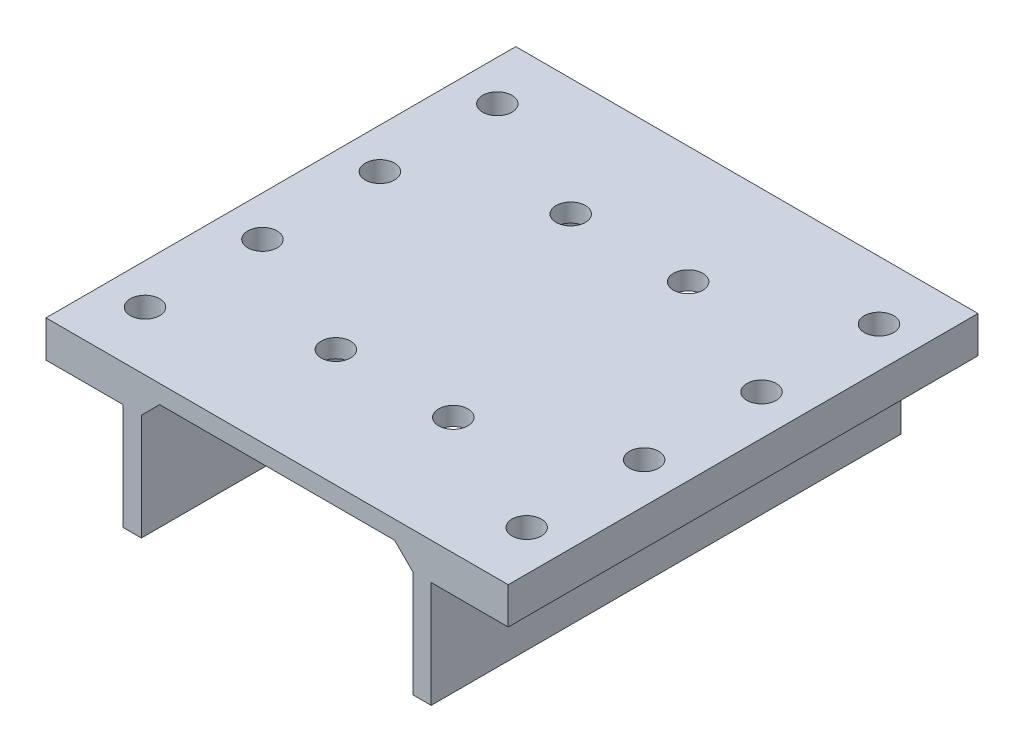
ISO-10303-21;
HEADER;
FILE_DESCRIPTION(('STEP AP214'),'2;1');
FILE_NAME('part.step','',(''),(''),'','','');
FILE_SCHEMA(('AUTOMOTIVE_DESIGN { 1 0 10303 214 1 1 1 1 }'));
ENDSEC;
DATA;
#1=APPLICATION_CONTEXT('core data for automotive mechanical design processes');
#2=APPLICATION_PROTOCOL_DEFINITION('international standard','automotive_design',2000,#1);
#3=PRODUCT_CONTEXT('',#1,'mechanical');
#4=PRODUCT('Part','Part','',(#3));
#5=PRODUCT_RELATED_PRODUCT_CATEGORY('part','',(#4));
#6=PRODUCT_DEFINITION_FORMATION('','',#4);
#7=PRODUCT_DEFINITION_CONTEXT('part definition',#1,'design');
#8=PRODUCT_DEFINITION('design','',#6,#7);
#9=PRODUCT_DEFINITION_SHAPE('','',#8);
#10=(LENGTH_UNIT() NAMED_UNIT(*) SI_UNIT(.MILLI.,.METRE.));
#11=(NAMED_UNIT(*) PLANE_ANGLE_UNIT() SI_UNIT($,.RADIAN.));
#12=(NAMED_UNIT(*) SI_UNIT($,.STERADIAN.) SOLID_ANGLE_UNIT());
#13=UNCERTAINTY_MEASURE_WITH_UNIT(LENGTH_MEASURE(1.E-05),#10,'distance_accuracy_value','');
#14=(GEOMETRIC_REPRESENTATION_CONTEXT(3) GLOBAL_UNCERTAINTY_ASSIGNED_CONTEXT((#13)) GLOBAL_UNIT_ASSIGNED_CONTEXT((#10,
#11,#12)) REPRESENTATION_CONTEXT('',''));
#15=CARTESIAN_POINT('',(0.,0.,0.));
#16=DIRECTION('',(0.,0.,1.));
#17=DIRECTION('',(1.,0.,0.));
#18=AXIS2_PLACEMENT_3D('',#15,#16,#17);
#19=CARTESIAN_POINT('',(89.211261032544,90.34609206336,101.6));
#20=DIRECTION('',(0.,1.,0.));
#21=DIRECTION('',(0.,0.,1.));
#22=AXIS2_PLACEMENT_3D('',#19,#20,#21);
#23=PLANE('',#22);
#24=DIRECTION('',(1.,0.,0.));
#25=VECTOR('',#24,1.);
#26=CARTESIAN_POINT('',(89.211261032544,90.34609206336,0.));
#27=LINE('',#26,#25);
#28=CARTESIAN_POINT('',(89.211261032544,90.34609206336,0.));
#29=VERTEX_POINT('',#28);
#30=CARTESIAN_POINT('',(93.173661032544,90.34609206336,0.));
#31=VERTEX_POINT('',#30);
#32=EDGE_CURVE('E167',#29,#31,#27,.T.);
#33=ORIENTED_EDGE('',*,*,#32,.T.);
#34=DIRECTION('',(0.,0.,-1.));
#35=VECTOR('',#34,1.);
#36=CARTESIAN_POINT('',(93.173661032544,90.34609206336,101.6));
#37=LINE('',#36,#35);
#38=CARTESIAN_POINT('',(93.173661032544,90.34609206336,101.6));
#39=VERTEX_POINT('',#38);
#40=EDGE_CURVE('E11',#39,#31,#37,.T.);
#41=ORIENTED_EDGE('',*,*,#40,.F.);
#42=DIRECTION('',(1.,0.,0.));
#43=VECTOR('',#42,1.);
#44=CARTESIAN_POINT('',(89.211261032544,90.34609206336,101.6));
#45=LINE('',#44,#43);
#46=CARTESIAN_POINT('',(89.211261032544,90.34609206336,101.6));
#47=VERTEX_POINT('',#46);
#48=EDGE_CURVE('E194',#47,#39,#45,.T.);
#49=ORIENTED_EDGE('',*,*,#48,.F.);
#50=DIRECTION('',(0.,0.,-1.));
#51=VECTOR('',#50,1.);
#52=CARTESIAN_POINT('',(89.211261032544,90.34609206336,101.6));
#53=LINE('',#52,#51);
#54=EDGE_CURVE('E163',#47,#29,#53,.T.);
#55=ORIENTED_EDGE('',*,*,#54,.T.);
#56=EDGE_LOOP('',(#33,#41,#49,#55));
#57=FACE_BOUND('',#56,.T.);
#58=ADVANCED_FACE('F33',(#57),#23,.F.);
#59=CARTESIAN_POINT('',(93.173661032544,90.34609206336,101.6));
#60=DIRECTION('',(-1.,0.,0.));
#61=DIRECTION('',(0.,0.,1.));
#62=AXIS2_PLACEMENT_3D('',#59,#60,#61);
#63=PLANE('',#62);
#64=CARTESIAN_POINT('',(93.173661032544,99.87109206336,76.2));
#65=DIRECTION('',(-1.,0.,0.));
#66=DIRECTION('',(0.,0.,1.));
#67=AXIS2_PLACEMENT_3D('',#64,#65,#66);
#68=CIRCLE('',#67,3.17500000000001);
#69=CARTESIAN_POINT('',(93.173661032544,99.87109206336,79.375));
#70=VERTEX_POINT('',#69);
#71=EDGE_CURVE('E578',#70,#70,#68,.T.);
#72=ORIENTED_EDGE('',*,*,#71,.T.);
#73=EDGE_LOOP('',(#72));
#74=FACE_BOUND('',#73,.T.);
#75=CARTESIAN_POINT('',(93.173661032544,99.87109206336,25.4));
#76=DIRECTION('',(-1.,0.,0.));
#77=DIRECTION('',(0.,0.,1.));
#78=AXIS2_PLACEMENT_3D('',#75,#76,#77);
#79=CIRCLE('',#78,3.175);
#80=CARTESIAN_POINT('',(93.173661032544,99.87109206336,28.575));
#81=VERTEX_POINT('',#80);
#82=EDGE_CURVE('E594',#81,#81,#79,.T.);
#83=ORIENTED_EDGE('',*,*,#82,.T.);
#84=EDGE_LOOP('',(#83));
#85=FACE_BOUND('',#84,.T.);
#86=DIRECTION('',(0.,1.,0.));
#87=VECTOR('',#86,1.);
#88=CARTESIAN_POINT('',(93.173661032544,90.34609206336,0.));
#89=LINE('',#88,#87);
#90=CARTESIAN_POINT('',(93.173661032544,113.35849206336,0.));
#91=VERTEX_POINT('',#90);
#92=EDGE_CURVE('E170',#31,#91,#89,.T.);
#93=ORIENTED_EDGE('',*,*,#92,.T.);
#94=DIRECTION('',(0.,0.,-1.));
#95=VECTOR('',#94,1.);
#96=CARTESIAN_POINT('',(93.173661032544,113.35849206336,101.6));
#97=LINE('',#96,#95);
#98=CARTESIAN_POINT('',(93.173661032544,113.35849206336,101.6));
#99=VERTEX_POINT('',#98);
#100=EDGE_CURVE('E42',#99,#91,#97,.T.);
#101=ORIENTED_EDGE('',*,*,#100,.F.);
#102=DIRECTION('',(0.,1.,0.));
#103=VECTOR('',#102,1.);
#104=CARTESIAN_POINT('',(93.173661032544,90.34609206336,101.6));
#105=LINE('',#104,#103);
#106=EDGE_CURVE('E112',#39,#99,#105,.T.);
#107=ORIENTED_EDGE('',*,*,#106,.F.);
#108=ORIENTED_EDGE('',*,*,#40,.T.);
#109=EDGE_LOOP('',(#93,#101,#107,#108));
#110=FACE_BOUND('',#109,.T.);
#111=ADVANCED_FACE('F305',(#74,#85,#110),#63,.F.);
#112=CARTESIAN_POINT('',(93.173661032544,113.35849206336,101.6));
#113=DIRECTION('',(-0.707106781186545,0.70710678118655,0.));
#114=DIRECTION('',(-0.70710678118655,-0.707106781186545,0.));
#115=AXIS2_PLACEMENT_3D('',#112,#113,#114);
#116=PLANE('',#115);
#117=DIRECTION('',(0.70710678118655,0.707106781186545,0.));
#118=VECTOR('',#117,1.);
#119=CARTESIAN_POINT('',(93.173661032544,113.35849206336,0.));
#120=LINE('',#119,#118);
#121=CARTESIAN_POINT('',(97.136061032544,117.32089206336,0.));
#122=VERTEX_POINT('',#121);
#123=EDGE_CURVE('E173',#91,#122,#120,.T.);
#124=ORIENTED_EDGE('',*,*,#123,.T.);
#125=DIRECTION('',(0.,0.,-1.));
#126=VECTOR('',#125,1.);
#127=CARTESIAN_POINT('',(97.136061032544,117.32089206336,101.6));
#128=LINE('',#127,#126);
#129=CARTESIAN_POINT('',(97.136061032544,117.32089206336,101.6));
#130=VERTEX_POINT('',#129);
#131=EDGE_CURVE('E219',#130,#122,#128,.T.);
#132=ORIENTED_EDGE('',*,*,#131,.F.);
#133=DIRECTION('',(0.70710678118655,0.707106781186545,0.));
#134=VECTOR('',#133,1.);
#135=CARTESIAN_POINT('',(93.173661032544,113.35849206336,101.6));
#136=LINE('',#135,#134);
#137=EDGE_CURVE('E259',#99,#130,#136,.T.);
#138=ORIENTED_EDGE('',*,*,#137,.F.);
#139=ORIENTED_EDGE('',*,*,#100,.T.);
#140=EDGE_LOOP('',(#124,#132,#138,#139));
#141=FACE_BOUND('',#140,.T.);
#142=ADVANCED_FACE('F309',(#141),#116,.F.);
#143=CARTESIAN_POINT('',(97.136061032544,117.32089206336,101.6));
#144=DIRECTION('',(0.,1.,0.));
#145=DIRECTION('',(0.,0.,1.));
#146=AXIS2_PLACEMENT_3D('',#143,#144,#145);
#147=PLANE('',#146);
#148=CARTESIAN_POINT('',(109.836061032544,117.32089206336,25.4000000000002));
#149=DIRECTION('',(0.,1.,0.));
#150=DIRECTION('',(0.,0.,1.));
#151=AXIS2_PLACEMENT_3D('',#148,#149,#150);
#152=CIRCLE('',#151,3.175);
#153=CARTESIAN_POINT('',(109.836061032544,117.32089206336,28.5750000000002));
#154=VERTEX_POINT('',#153);
#155=EDGE_CURVE('E612',#154,#154,#152,.T.);
#156=ORIENTED_EDGE('',*,*,#155,.T.);
#157=EDGE_LOOP('',(#156));
#158=FACE_BOUND('',#157,.T.);
#159=CARTESIAN_POINT('',(109.836061032545,117.32089206336,76.2000000000002));
#160=DIRECTION('',(0.,1.,0.));
#161=DIRECTION('',(0.,0.,1.));
#162=AXIS2_PLACEMENT_3D('',#159,#160,#161);
#163=CIRCLE('',#162,3.175);
#164=CARTESIAN_POINT('',(109.836061032545,117.32089206336,79.3750000000002));
#165=VERTEX_POINT('',#164);
#166=EDGE_CURVE('E609',#165,#165,#163,.T.);
#167=ORIENTED_EDGE('',*,*,#166,.T.);
#168=EDGE_LOOP('',(#167));
#169=FACE_BOUND('',#168,.T.);
#170=CARTESIAN_POINT('',(135.236061032545,117.32089206336,76.2));
#171=DIRECTION('',(0.,1.,0.));
#172=DIRECTION('',(0.,0.,1.));
#173=AXIS2_PLACEMENT_3D('',#170,#171,#172);
#174=CIRCLE('',#173,3.175);
#175=CARTESIAN_POINT('',(135.236061032545,117.32089206336,79.375));
#176=VERTEX_POINT('',#175);
#177=EDGE_CURVE('E601',#176,#176,#174,.T.);
#178=ORIENTED_EDGE('',*,*,#177,.T.);
#179=EDGE_LOOP('',(#178));
#180=FACE_BOUND('',#179,.T.);
#181=CARTESIAN_POINT('',(135.236061032544,117.32089206336,25.4));
#182=DIRECTION('',(0.,1.,0.));
#183=DIRECTION('',(0.,0.,1.));
#184=AXIS2_PLACEMENT_3D('',#181,#182,#183);
#185=CIRCLE('',#184,3.175);
#186=CARTESIAN_POINT('',(135.236061032544,117.32089206336,28.575));
#187=VERTEX_POINT('',#186);
#188=EDGE_CURVE('E618',#187,#187,#185,.T.);
#189=ORIENTED_EDGE('',*,*,#188,.T.);
#190=EDGE_LOOP('',(#189));
#191=FACE_BOUND('',#190,.T.);
#192=DIRECTION('',(1.,0.,0.));
#193=VECTOR('',#192,1.);
#194=CARTESIAN_POINT('',(97.136061032544,117.32089206336,0.));
#195=LINE('',#194,#193);
#196=CARTESIAN_POINT('',(147.936061032544,117.32089206336,0.));
#197=VERTEX_POINT('',#196);
#198=EDGE_CURVE('E175',#122,#197,#195,.T.);
#199=ORIENTED_EDGE('',*,*,#198,.T.);
#200=DIRECTION('',(0.,0.,-1.));
#201=VECTOR('',#200,1.);
#202=CARTESIAN_POINT('',(147.936061032544,117.32089206336,101.6));
#203=LINE('',#202,#201);
#204=CARTESIAN_POINT('',(147.936061032544,117.32089206336,101.6));
#205=VERTEX_POINT('',#204);
#206=EDGE_CURVE('E216',#205,#197,#203,.T.);
#207=ORIENTED_EDGE('',*,*,#206,.F.);
#208=DIRECTION('',(1.,0.,0.));
#209=VECTOR('',#208,1.);
#210=CARTESIAN_POINT('',(97.136061032544,117.32089206336,101.6));
#211=LINE('',#210,#209);
#212=EDGE_CURVE('E261',#130,#205,#211,.T.);
#213=ORIENTED_EDGE('',*,*,#212,.F.);
#214=ORIENTED_EDGE('',*,*,#131,.T.);
#215=EDGE_LOOP('',(#199,#207,#213,#214));
#216=FACE_BOUND('',#215,.T.);
#217=ADVANCED_FACE('F314',(#158,#169,#180,#191,#216),#147,.F.);
#218=CARTESIAN_POINT('',(147.936061032544,117.32089206336,101.6));
#219=DIRECTION('',(0.707106781186546,0.707106781186549,0.));
#220=DIRECTION('',(-0.707106781186549,0.707106781186546,0.));
#221=AXIS2_PLACEMENT_3D('',#218,#219,#220);
#222=PLANE('',#221);
#223=DIRECTION('',(0.707106781186549,-0.707106781186546,0.));
#224=VECTOR('',#223,1.);
#225=CARTESIAN_POINT('',(147.936061032544,117.32089206336,0.));
#226=LINE('',#225,#224);
#227=CARTESIAN_POINT('',(151.898461032544,113.35849206336,0.));
#228=VERTEX_POINT('',#227);
#229=EDGE_CURVE('E177',#197,#228,#226,.T.);
#230=ORIENTED_EDGE('',*,*,#229,.T.);
#231=DIRECTION('',(0.,0.,-1.));
#232=VECTOR('',#231,1.);
#233=CARTESIAN_POINT('',(151.898461032544,113.35849206336,101.6));
#234=LINE('',#233,#232);
#235=CARTESIAN_POINT('',(151.898461032544,113.35849206336,101.6));
#236=VERTEX_POINT('',#235);
#237=EDGE_CURVE('E213',#236,#228,#234,.T.);
#238=ORIENTED_EDGE('',*,*,#237,.F.);
#239=DIRECTION('',(0.707106781186549,-0.707106781186546,0.));
#240=VECTOR('',#239,1.);
#241=CARTESIAN_POINT('',(147.936061032544,117.32089206336,101.6));
#242=LINE('',#241,#240);
#243=EDGE_CURVE('E263',#205,#236,#242,.T.);
#244=ORIENTED_EDGE('',*,*,#243,.F.);
#245=ORIENTED_EDGE('',*,*,#206,.T.);
#246=EDGE_LOOP('',(#230,#238,#244,#245));
#247=FACE_BOUND('',#246,.T.);
#248=ADVANCED_FACE('F322',(#247),#222,.F.);
#249=CARTESIAN_POINT('',(151.898461032544,113.35849206336,101.6));
#250=DIRECTION('',(1.,0.,0.));
#251=DIRECTION('',(0.,0.,-1.));
#252=AXIS2_PLACEMENT_3D('',#249,#250,#251);
#253=PLANE('',#252);
#254=CARTESIAN_POINT('',(151.898461032544,99.87109206336,76.2));
#255=DIRECTION('',(1.,0.,0.));
#256=DIRECTION('',(0.,0.,-1.));
#257=AXIS2_PLACEMENT_3D('',#254,#255,#256);
#258=CIRCLE('',#257,3.17500000000001);
#259=CARTESIAN_POINT('',(151.898461032544,99.87109206336,73.025));
#260=VERTEX_POINT('',#259);
#261=EDGE_CURVE('E577',#260,#260,#258,.T.);
#262=ORIENTED_EDGE('',*,*,#261,.T.);
#263=EDGE_LOOP('',(#262));
#264=FACE_BOUND('',#263,.T.);
#265=CARTESIAN_POINT('',(151.898461032544,99.87109206336,25.4));
#266=DIRECTION('',(1.,0.,0.));
#267=DIRECTION('',(0.,0.,-1.));
#268=AXIS2_PLACEMENT_3D('',#265,#266,#267);
#269=CIRCLE('',#268,3.175);
#270=CARTESIAN_POINT('',(151.898461032544,99.87109206336,22.225));
#271=VERTEX_POINT('',#270);
#272=EDGE_CURVE('E591',#271,#271,#269,.T.);
#273=ORIENTED_EDGE('',*,*,#272,.T.);
#274=EDGE_LOOP('',(#273));
#275=FACE_BOUND('',#274,.T.);
#276=DIRECTION('',(0.,-1.,0.));
#277=VECTOR('',#276,1.);
#278=CARTESIAN_POINT('',(151.898461032544,113.35849206336,0.));
#279=LINE('',#278,#277);
#280=CARTESIAN_POINT('',(151.898461032544,90.34609206336,0.));
#281=VERTEX_POINT('',#280);
#282=EDGE_CURVE('E179',#228,#281,#279,.T.);
#283=ORIENTED_EDGE('',*,*,#282,.T.);
#284=DIRECTION('',(0.,0.,-1.));
#285=VECTOR('',#284,1.);
#286=CARTESIAN_POINT('',(151.898461032544,90.34609206336,101.6));
#287=LINE('',#286,#285);
#288=CARTESIAN_POINT('',(151.898461032544,90.34609206336,101.6));
#289=VERTEX_POINT('',#288);
#290=EDGE_CURVE('E210',#289,#281,#287,.T.);
#291=ORIENTED_EDGE('',*,*,#290,.F.);
#292=DIRECTION('',(0.,-1.,0.));
#293=VECTOR('',#292,1.);
#294=CARTESIAN_POINT('',(151.898461032544,113.35849206336,101.6));
#295=LINE('',#294,#293);
#296=EDGE_CURVE('E265',#236,#289,#295,.T.);
#297=ORIENTED_EDGE('',*,*,#296,.F.);
#298=ORIENTED_EDGE('',*,*,#237,.T.);
#299=EDGE_LOOP('',(#283,#291,#297,#298));
#300=FACE_BOUND('',#299,.T.);
#301=ADVANCED_FACE('F326',(#264,#275,#300),#253,.F.);
#302=CARTESIAN_POINT('',(151.898461032544,90.34609206336,101.6));
#303=DIRECTION('',(0.,1.,0.));
#304=DIRECTION('',(0.,0.,1.));
#305=AXIS2_PLACEMENT_3D('',#302,#303,#304);
#306=PLANE('',#305);
#307=DIRECTION('',(1.,0.,0.));
#308=VECTOR('',#307,1.);
#309=CARTESIAN_POINT('',(151.898461032544,90.34609206336,0.));
#310=LINE('',#309,#308);
#311=CARTESIAN_POINT('',(155.860861032544,90.34609206336,0.));
#312=VERTEX_POINT('',#311);
#313=EDGE_CURVE('E181',#281,#312,#310,.T.);
#314=ORIENTED_EDGE('',*,*,#313,.T.);
#315=DIRECTION('',(0.,0.,-1.));
#316=VECTOR('',#315,1.);
#317=CARTESIAN_POINT('',(155.860861032544,90.34609206336,101.6));
#318=LINE('',#317,#316);
#319=CARTESIAN_POINT('',(155.860861032544,90.34609206336,101.6));
#320=VERTEX_POINT('',#319);
#321=EDGE_CURVE('E207',#320,#312,#318,.T.);
#322=ORIENTED_EDGE('',*,*,#321,.F.);
#323=DIRECTION('',(1.,0.,0.));
#324=VECTOR('',#323,1.);
#325=CARTESIAN_POINT('',(151.898461032544,90.34609206336,101.6));
#326=LINE('',#325,#324);
#327=EDGE_CURVE('E267',#289,#320,#326,.T.);
#328=ORIENTED_EDGE('',*,*,#327,.F.);
#329=ORIENTED_EDGE('',*,*,#290,.T.);
#330=EDGE_LOOP('',(#314,#322,#328,#329));
#331=FACE_BOUND('',#330,.T.);
#332=ADVANCED_FACE('F330',(#331),#306,.F.);
#333=CARTESIAN_POINT('',(155.860861032544,90.34609206336,101.6));
#334=DIRECTION('',(-1.,0.,0.));
#335=DIRECTION('',(0.,0.,1.));
#336=AXIS2_PLACEMENT_3D('',#333,#334,#335);
#337=PLANE('',#336);
#338=CARTESIAN_POINT('',(155.860861032544,99.87109206336,76.2));
#339=DIRECTION('',(-1.,0.,0.));
#340=DIRECTION('',(0.,0.,1.));
#341=AXIS2_PLACEMENT_3D('',#338,#339,#340);
#342=CIRCLE('',#341,3.17500000000001);
#343=CARTESIAN_POINT('',(155.860861032544,99.87109206336,79.375));
#344=VERTEX_POINT('',#343);
#345=EDGE_CURVE('E574',#344,#344,#342,.T.);
#346=ORIENTED_EDGE('',*,*,#345,.T.);
#347=EDGE_LOOP('',(#346));
#348=FACE_BOUND('',#347,.T.);
#349=CARTESIAN_POINT('',(155.860861032544,99.87109206336,25.4));
#350=DIRECTION('',(-1.,0.,0.));
#351=DIRECTION('',(0.,0.,1.));
#352=AXIS2_PLACEMENT_3D('',#349,#350,#351);
#353=CIRCLE('',#352,3.175);
#354=CARTESIAN_POINT('',(155.860861032544,99.87109206336,28.575));
#355=VERTEX_POINT('',#354);
#356=EDGE_CURVE('E588',#355,#355,#353,.T.);
#357=ORIENTED_EDGE('',*,*,#356,.T.);
#358=EDGE_LOOP('',(#357));
#359=FACE_BOUND('',#358,.T.);
#360=DIRECTION('',(0.,1.,0.));
#361=VECTOR('',#360,1.);
#362=CARTESIAN_POINT('',(155.860861032544,90.34609206336,0.));
#363=LINE('',#362,#361);
#364=CARTESIAN_POINT('',(155.860861032544,113.35849206336,0.));
#365=VERTEX_POINT('',#364);
#366=EDGE_CURVE('E183',#312,#365,#363,.T.);
#367=ORIENTED_EDGE('',*,*,#366,.T.);
#368=DIRECTION('',(0.,0.,-1.));
#369=VECTOR('',#368,1.);
#370=CARTESIAN_POINT('',(155.860861032544,113.35849206336,101.6));
#371=LINE('',#370,#369);
#372=CARTESIAN_POINT('',(155.860861032544,113.35849206336,101.6));
#373=VERTEX_POINT('',#372);
#374=EDGE_CURVE('E204',#373,#365,#371,.T.);
#375=ORIENTED_EDGE('',*,*,#374,.F.);
#376=DIRECTION('',(0.,1.,0.));
#377=VECTOR('',#376,1.);
#378=CARTESIAN_POINT('',(155.860861032544,90.34609206336,101.6));
#379=LINE('',#378,#377);
#380=EDGE_CURVE('E269',#320,#373,#379,.T.);
#381=ORIENTED_EDGE('',*,*,#380,.F.);
#382=ORIENTED_EDGE('',*,*,#321,.T.);
#383=EDGE_LOOP('',(#367,#375,#381,#382));
#384=FACE_BOUND('',#383,.T.);
#385=ADVANCED_FACE('F334',(#348,#359,#384),#337,.F.);
#386=CARTESIAN_POINT('',(155.860861032544,113.35849206336,101.6));
#387=DIRECTION('',(0.,1.,0.));
#388=DIRECTION('',(0.,0.,1.));
#389=AXIS2_PLACEMENT_3D('',#386,#387,#388);
#390=PLANE('',#389);
#391=CARTESIAN_POINT('',(163.811061032544,113.35849206336,38.1));
#392=DIRECTION('',(0.,1.,0.));
#393=DIRECTION('',(0.,0.,1.));
#394=AXIS2_PLACEMENT_3D('',#391,#392,#393);
#395=CIRCLE('',#394,3.175);
#396=CARTESIAN_POINT('',(163.811061032544,113.35849206336,41.275));
#397=VERTEX_POINT('',#396);
#398=EDGE_CURVE('E244',#397,#397,#395,.T.);
#399=ORIENTED_EDGE('',*,*,#398,.T.);
#400=EDGE_LOOP('',(#399));
#401=FACE_BOUND('',#400,.T.);
#402=CARTESIAN_POINT('',(163.811061032544,113.35849206336,63.5));
#403=DIRECTION('',(0.,1.,0.));
#404=DIRECTION('',(0.,0.,1.));
#405=AXIS2_PLACEMENT_3D('',#402,#403,#404);
#406=CIRCLE('',#405,3.175);
#407=CARTESIAN_POINT('',(163.811061032544,113.35849206336,66.675));
#408=VERTEX_POINT('',#407);
#409=EDGE_CURVE('E239',#408,#408,#406,.T.);
#410=ORIENTED_EDGE('',*,*,#409,.T.);
#411=EDGE_LOOP('',(#410));
#412=FACE_BOUND('',#411,.T.);
#413=CARTESIAN_POINT('',(163.811061032544,113.35849206336,88.9));
#414=DIRECTION('',(0.,1.,0.));
#415=DIRECTION('',(0.,0.,1.));
#416=AXIS2_PLACEMENT_3D('',#413,#414,#415);
#417=CIRCLE('',#416,3.175);
#418=CARTESIAN_POINT('',(163.811061032544,113.35849206336,92.075));
#419=VERTEX_POINT('',#418);
#420=EDGE_CURVE('E235',#419,#419,#417,.T.);
#421=ORIENTED_EDGE('',*,*,#420,.T.);
#422=EDGE_LOOP('',(#421));
#423=FACE_BOUND('',#422,.T.);
#424=CARTESIAN_POINT('',(163.811061032544,113.35849206336,12.7));
#425=DIRECTION('',(0.,1.,0.));
#426=DIRECTION('',(0.,0.,1.));
#427=AXIS2_PLACEMENT_3D('',#424,#425,#426);
#428=CIRCLE('',#427,3.175);
#429=CARTESIAN_POINT('',(163.811061032544,113.35849206336,15.875));
#430=VERTEX_POINT('',#429);
#431=EDGE_CURVE('E171',#430,#430,#428,.T.);
#432=ORIENTED_EDGE('',*,*,#431,.T.);
#433=EDGE_LOOP('',(#432));
#434=FACE_BOUND('',#433,.T.);
#435=DIRECTION('',(1.,0.,0.));
#436=VECTOR('',#435,1.);
#437=CARTESIAN_POINT('',(155.860861032544,113.35849206336,0.));
#438=LINE('',#437,#436);
#439=CARTESIAN_POINT('',(172.523261032544,113.35849206336,0.));
#440=VERTEX_POINT('',#439);
#441=EDGE_CURVE('E185',#365,#440,#438,.T.);
#442=ORIENTED_EDGE('',*,*,#441,.T.);
#443=DIRECTION('',(0.,0.,-1.));
#444=VECTOR('',#443,1.);
#445=CARTESIAN_POINT('',(172.523261032544,113.35849206336,101.6));
#446=LINE('',#445,#444);
#447=CARTESIAN_POINT('',(172.523261032544,113.35849206336,101.6));
#448=VERTEX_POINT('',#447);
#449=EDGE_CURVE('E201',#448,#440,#446,.T.);
#450=ORIENTED_EDGE('',*,*,#449,.F.);
#451=DIRECTION('',(1.,0.,0.));
#452=VECTOR('',#451,1.);
#453=CARTESIAN_POINT('',(155.860861032544,113.35849206336,101.6));
#454=LINE('',#453,#452);
#455=EDGE_CURVE('E271',#373,#448,#454,.T.);
#456=ORIENTED_EDGE('',*,*,#455,.F.);
#457=ORIENTED_EDGE('',*,*,#374,.T.);
#458=EDGE_LOOP('',(#442,#450,#456,#457));
#459=FACE_BOUND('',#458,.T.);
#460=ADVANCED_FACE('F338',(#401,#412,#423,#434,#459),#390,.F.);
#461=CARTESIAN_POINT('',(172.523261032544,113.35849206336,101.6));
#462=DIRECTION('',(-1.,0.,0.));
#463=DIRECTION('',(0.,0.,1.));
#464=AXIS2_PLACEMENT_3D('',#461,#462,#463);
#465=PLANE('',#464);
#466=DIRECTION('',(0.,1.,0.));
#467=VECTOR('',#466,1.);
#468=CARTESIAN_POINT('',(172.523261032544,113.35849206336,0.));
#469=LINE('',#468,#467);
#470=CARTESIAN_POINT('',(172.523261032544,121.28329206336,0.));
#471=VERTEX_POINT('',#470);
#472=EDGE_CURVE('E187',#440,#471,#469,.T.);
#473=ORIENTED_EDGE('',*,*,#472,.T.);
#474=DIRECTION('',(0.,0.,-1.));
#475=VECTOR('',#474,1.);
#476=CARTESIAN_POINT('',(172.523261032544,121.28329206336,101.6));
#477=LINE('',#476,#475);
#478=CARTESIAN_POINT('',(172.523261032544,121.28329206336,101.6));
#479=VERTEX_POINT('',#478);
#480=EDGE_CURVE('E198',#479,#471,#477,.T.);
#481=ORIENTED_EDGE('',*,*,#480,.F.);
#482=DIRECTION('',(0.,1.,0.));
#483=VECTOR('',#482,1.);
#484=CARTESIAN_POINT('',(172.523261032544,113.35849206336,101.6));
#485=LINE('',#484,#483);
#486=EDGE_CURVE('E273',#448,#479,#485,.T.);
#487=ORIENTED_EDGE('',*,*,#486,.F.);
#488=ORIENTED_EDGE('',*,*,#449,.T.);
#489=EDGE_LOOP('',(#473,#481,#487,#488));
#490=FACE_BOUND('',#489,.T.);
#491=ADVANCED_FACE('F279',(#490),#465,.F.);
#492=CARTESIAN_POINT('',(172.523261032544,121.28329206336,101.6));
#493=DIRECTION('',(0.,-1.,0.));
#494=DIRECTION('',(0.,0.,-1.));
#495=AXIS2_PLACEMENT_3D('',#492,#493,#494);
#496=PLANE('',#495);
#497=CARTESIAN_POINT('',(109.836061032544,121.28329206336,25.4000000000002));
#498=DIRECTION('',(0.,1.,0.));
#499=DIRECTION('',(0.,0.,1.));
#500=AXIS2_PLACEMENT_3D('',#497,#498,#499);
#501=CIRCLE('',#500,3.175);
#502=CARTESIAN_POINT('',(109.836061032544,121.28329206336,28.5750000000002));
#503=VERTEX_POINT('',#502);
#504=EDGE_CURVE('E598',#503,#503,#501,.T.);
#505=ORIENTED_EDGE('',*,*,#504,.F.);
#506=EDGE_LOOP('',(#505));
#507=FACE_BOUND('',#506,.T.);
#508=CARTESIAN_POINT('',(109.836061032545,121.28329206336,76.2000000000002));
#509=DIRECTION('',(0.,1.,0.));
#510=DIRECTION('',(0.,0.,1.));
#511=AXIS2_PLACEMENT_3D('',#508,#509,#510);
#512=CIRCLE('',#511,3.175);
#513=CARTESIAN_POINT('',(109.836061032545,121.28329206336,79.3750000000002));
#514=VERTEX_POINT('',#513);
#515=EDGE_CURVE('E602',#514,#514,#512,.T.);
#516=ORIENTED_EDGE('',*,*,#515,.F.);
#517=EDGE_LOOP('',(#516));
#518=FACE_BOUND('',#517,.T.);
#519=CARTESIAN_POINT('',(135.236061032545,121.28329206336,76.2));
#520=DIRECTION('',(0.,1.,0.));
#521=DIRECTION('',(0.,0.,1.));
#522=AXIS2_PLACEMENT_3D('',#519,#520,#521);
#523=CIRCLE('',#522,3.175);
#524=CARTESIAN_POINT('',(135.236061032545,121.28329206336,79.375));
#525=VERTEX_POINT('',#524);
#526=EDGE_CURVE('E597',#525,#525,#523,.T.);
#527=ORIENTED_EDGE('',*,*,#526,.F.);
#528=EDGE_LOOP('',(#527));
#529=FACE_BOUND('',#528,.T.);
#530=CARTESIAN_POINT('',(135.236061032544,121.28329206336,25.4));
#531=DIRECTION('',(0.,1.,0.));
#532=DIRECTION('',(0.,0.,1.));
#533=AXIS2_PLACEMENT_3D('',#530,#531,#532);
#534=CIRCLE('',#533,3.175);
#535=CARTESIAN_POINT('',(135.236061032544,121.28329206336,28.575));
#536=VERTEX_POINT('',#535);
#537=EDGE_CURVE('E615',#536,#536,#534,.T.);
#538=ORIENTED_EDGE('',*,*,#537,.F.);
#539=EDGE_LOOP('',(#538));
#540=FACE_BOUND('',#539,.T.);
#541=CARTESIAN_POINT('',(163.811061032544,121.28329206336,38.1));
#542=DIRECTION('',(0.,1.,0.));
#543=DIRECTION('',(0.,0.,1.));
#544=AXIS2_PLACEMENT_3D('',#541,#542,#543);
#545=CIRCLE('',#544,3.175);
#546=CARTESIAN_POINT('',(163.811061032544,121.28329206336,41.275));
#547=VERTEX_POINT('',#546);
#548=EDGE_CURVE('E228',#547,#547,#545,.T.);
#549=ORIENTED_EDGE('',*,*,#548,.F.);
#550=EDGE_LOOP('',(#549));
#551=FACE_BOUND('',#550,.T.);
#552=CARTESIAN_POINT('',(163.811061032544,121.28329206336,63.5));
#553=DIRECTION('',(0.,1.,0.));
#554=DIRECTION('',(0.,0.,1.));
#555=AXIS2_PLACEMENT_3D('',#552,#553,#554);
#556=CIRCLE('',#555,3.175);
#557=CARTESIAN_POINT('',(163.811061032544,121.28329206336,66.675));
#558=VERTEX_POINT('',#557);
#559=EDGE_CURVE('E624',#558,#558,#556,.T.);
#560=ORIENTED_EDGE('',*,*,#559,.F.);
#561=EDGE_LOOP('',(#560));
#562=FACE_BOUND('',#561,.T.);
#563=CARTESIAN_POINT('',(163.811061032544,121.28329206336,88.9));
#564=DIRECTION('',(0.,1.,0.));
#565=DIRECTION('',(0.,0.,1.));
#566=AXIS2_PLACEMENT_3D('',#563,#564,#565);
#567=CIRCLE('',#566,3.175);
#568=CARTESIAN_POINT('',(163.811061032544,121.28329206336,92.075));
#569=VERTEX_POINT('',#568);
#570=EDGE_CURVE('E627',#569,#569,#567,.T.);
#571=ORIENTED_EDGE('',*,*,#570,.F.);
#572=EDGE_LOOP('',(#571));
#573=FACE_BOUND('',#572,.T.);
#574=CARTESIAN_POINT('',(81.261061032544,121.28329206336,12.7));
#575=DIRECTION('',(0.,1.,0.));
#576=DIRECTION('',(0.,0.,1.));
#577=AXIS2_PLACEMENT_3D('',#574,#575,#576);
#578=CIRCLE('',#577,3.175);
#579=CARTESIAN_POINT('',(81.261061032544,121.28329206336,15.875));
#580=VERTEX_POINT('',#579);
#581=EDGE_CURVE('E621',#580,#580,#578,.T.);
#582=ORIENTED_EDGE('',*,*,#581,.F.);
#583=EDGE_LOOP('',(#582));
#584=FACE_BOUND('',#583,.T.);
#585=CARTESIAN_POINT('',(81.261061032544,121.28329206336,88.9));
#586=DIRECTION('',(0.,1.,0.));
#587=DIRECTION('',(0.,0.,1.));
#588=AXIS2_PLACEMENT_3D('',#585,#586,#587);
#589=CIRCLE('',#588,3.175);
#590=CARTESIAN_POINT('',(81.261061032544,121.28329206336,92.075));
#591=VERTEX_POINT('',#590);
#592=EDGE_CURVE('E631',#591,#591,#589,.T.);
#593=ORIENTED_EDGE('',*,*,#592,.F.);
#594=EDGE_LOOP('',(#593));
#595=FACE_BOUND('',#594,.T.);
#596=CARTESIAN_POINT('',(81.261061032544,121.28329206336,63.5));
#597=DIRECTION('',(0.,1.,0.));
#598=DIRECTION('',(0.,0.,1.));
#599=AXIS2_PLACEMENT_3D('',#596,#597,#598);
#600=CIRCLE('',#599,3.175);
#601=CARTESIAN_POINT('',(81.261061032544,121.28329206336,66.675));
#602=VERTEX_POINT('',#601);
#603=EDGE_CURVE('E247',#602,#602,#600,.T.);
#604=ORIENTED_EDGE('',*,*,#603,.F.);
#605=EDGE_LOOP('',(#604));
#606=FACE_BOUND('',#605,.T.);
#607=CARTESIAN_POINT('',(81.261061032544,121.28329206336,38.1));
#608=DIRECTION('',(0.,1.,0.));
#609=DIRECTION('',(0.,0.,1.));
#610=AXIS2_PLACEMENT_3D('',#607,#608,#609);
#611=CIRCLE('',#610,3.175);
#612=CARTESIAN_POINT('',(81.261061032544,121.28329206336,41.275));
#613=VERTEX_POINT('',#612);
#614=EDGE_CURVE('E630',#613,#613,#611,.T.);
#615=ORIENTED_EDGE('',*,*,#614,.F.);
#616=EDGE_LOOP('',(#615));
#617=FACE_BOUND('',#616,.T.);
#618=CARTESIAN_POINT('',(163.811061032544,121.28329206336,12.7));
#619=DIRECTION('',(0.,1.,0.));
#620=DIRECTION('',(0.,0.,1.));
#621=AXIS2_PLACEMENT_3D('',#618,#619,#620);
#622=CIRCLE('',#621,3.175);
#623=CARTESIAN_POINT('',(163.811061032544,121.28329206336,15.875));
#624=VERTEX_POINT('',#623);
#625=EDGE_CURVE('E252',#624,#624,#622,.T.);
#626=ORIENTED_EDGE('',*,*,#625,.F.);
#627=EDGE_LOOP('',(#626));
#628=FACE_BOUND('',#627,.T.);
#629=DIRECTION('',(-1.,0.,0.));
#630=VECTOR('',#629,1.);
#631=CARTESIAN_POINT('',(172.523261032544,121.28329206336,0.));
#632=LINE('',#631,#630);
#633=CARTESIAN_POINT('',(72.548861032544,121.28329206336,0.));
#634=VERTEX_POINT('',#633);
#635=EDGE_CURVE('E189',#471,#634,#632,.T.);
#636=ORIENTED_EDGE('',*,*,#635,.T.);
#637=DIRECTION('',(0.,0.,-1.));
#638=VECTOR('',#637,1.);
#639=CARTESIAN_POINT('',(72.548861032544,121.28329206336,101.6));
#640=LINE('',#639,#638);
#641=CARTESIAN_POINT('',(72.548861032544,121.28329206336,101.6));
#642=VERTEX_POINT('',#641);
#643=EDGE_CURVE('E158',#642,#634,#640,.T.);
#644=ORIENTED_EDGE('',*,*,#643,.F.);
#645=DIRECTION('',(-1.,0.,0.));
#646=VECTOR('',#645,1.);
#647=CARTESIAN_POINT('',(172.523261032544,121.28329206336,101.6));
#648=LINE('',#647,#646);
#649=EDGE_CURVE('E149',#479,#642,#648,.T.);
#650=ORIENTED_EDGE('',*,*,#649,.F.);
#651=ORIENTED_EDGE('',*,*,#480,.T.);
#652=EDGE_LOOP('',(#636,#644,#650,#651));
#653=FACE_BOUND('',#652,.T.);
#654=ADVANCED_FACE('F283',(#507,#518,#529,#540,#551,#562,#573,#584,#595,#606,#617,#628,#653),
#496,.F.);
#655=CARTESIAN_POINT('',(72.548861032544,121.28329206336,101.6));
#656=DIRECTION('',(1.,0.,0.));
#657=DIRECTION('',(0.,0.,-1.));
#658=AXIS2_PLACEMENT_3D('',#655,#656,#657);
#659=PLANE('',#658);
#660=DIRECTION('',(0.,-1.,0.));
#661=VECTOR('',#660,1.);
#662=CARTESIAN_POINT('',(72.548861032544,121.28329206336,0.));
#663=LINE('',#662,#661);
#664=CARTESIAN_POINT('',(72.548861032544,113.35849206336,0.));
#665=VERTEX_POINT('',#664);
#666=EDGE_CURVE('E157',#634,#665,#663,.T.);
#667=ORIENTED_EDGE('',*,*,#666,.T.);
#668=DIRECTION('',(0.,0.,-1.));
#669=VECTOR('',#668,1.);
#670=CARTESIAN_POINT('',(72.548861032544,113.35849206336,101.6));
#671=LINE('',#670,#669);
#672=CARTESIAN_POINT('',(72.548861032544,113.35849206336,101.6));
#673=VERTEX_POINT('',#672);
#674=EDGE_CURVE('E154',#673,#665,#671,.T.);
#675=ORIENTED_EDGE('',*,*,#674,.F.);
#676=DIRECTION('',(0.,-1.,0.));
#677=VECTOR('',#676,1.);
#678=CARTESIAN_POINT('',(72.548861032544,121.28329206336,101.6));
#679=LINE('',#678,#677);
#680=EDGE_CURVE('E143',#642,#673,#679,.T.);
#681=ORIENTED_EDGE('',*,*,#680,.F.);
#682=ORIENTED_EDGE('',*,*,#643,.T.);
#683=EDGE_LOOP('',(#667,#675,#681,#682));
#684=FACE_BOUND('',#683,.T.);
#685=ADVANCED_FACE('F155',(#684),#659,.F.);
#686=CARTESIAN_POINT('',(72.548861032544,113.35849206336,101.6));
#687=DIRECTION('',(0.,1.,0.));
#688=DIRECTION('',(0.,0.,1.));
#689=AXIS2_PLACEMENT_3D('',#686,#687,#688);
#690=PLANE('',#689);
#691=CARTESIAN_POINT('',(81.261061032544,113.35849206336,12.7));
#692=DIRECTION('',(0.,1.,0.));
#693=DIRECTION('',(0.,0.,1.));
#694=AXIS2_PLACEMENT_3D('',#691,#692,#693);
#695=CIRCLE('',#694,3.175);
#696=CARTESIAN_POINT('',(81.261061032544,113.35849206336,15.875));
#697=VERTEX_POINT('',#696);
#698=EDGE_CURVE('E36',#697,#697,#695,.T.);
#699=ORIENTED_EDGE('',*,*,#698,.T.);
#700=EDGE_LOOP('',(#699));
#701=FACE_BOUND('',#700,.T.);
#702=CARTESIAN_POINT('',(81.261061032544,113.35849206336,88.9));
#703=DIRECTION('',(0.,1.,0.));
#704=DIRECTION('',(0.,0.,1.));
#705=AXIS2_PLACEMENT_3D('',#702,#703,#704);
#706=CIRCLE('',#705,3.175);
#707=CARTESIAN_POINT('',(81.261061032544,113.35849206336,92.075));
#708=VERTEX_POINT('',#707);
#709=EDGE_CURVE('E230',#708,#708,#706,.T.);
#710=ORIENTED_EDGE('',*,*,#709,.T.);
#711=EDGE_LOOP('',(#710));
#712=FACE_BOUND('',#711,.T.);
#713=CARTESIAN_POINT('',(81.261061032544,113.35849206336,63.5));
#714=DIRECTION('',(0.,1.,0.));
#715=DIRECTION('',(0.,0.,1.));
#716=AXIS2_PLACEMENT_3D('',#713,#714,#715);
#717=CIRCLE('',#716,3.175);
#718=CARTESIAN_POINT('',(81.261061032544,113.35849206336,66.675));
#719=VERTEX_POINT('',#718);
#720=EDGE_CURVE('E227',#719,#719,#717,.T.);
#721=ORIENTED_EDGE('',*,*,#720,.T.);
#722=EDGE_LOOP('',(#721));
#723=FACE_BOUND('',#722,.T.);
#724=CARTESIAN_POINT('',(81.261061032544,113.35849206336,38.1));
#725=DIRECTION('',(0.,1.,0.));
#726=DIRECTION('',(0.,0.,1.));
#727=AXIS2_PLACEMENT_3D('',#724,#725,#726);
#728=CIRCLE('',#727,3.175);
#729=CARTESIAN_POINT('',(81.261061032544,113.35849206336,41.275));
#730=VERTEX_POINT('',#729);
#731=EDGE_CURVE('E224',#730,#730,#728,.T.);
#732=ORIENTED_EDGE('',*,*,#731,.T.);
#733=EDGE_LOOP('',(#732));
#734=FACE_BOUND('',#733,.T.);
#735=DIRECTION('',(1.,0.,0.));
#736=VECTOR('',#735,1.);
#737=CARTESIAN_POINT('',(72.548861032544,113.35849206336,0.));
#738=LINE('',#737,#736);
#739=CARTESIAN_POINT('',(89.211261032544,113.35849206336,0.));
#740=VERTEX_POINT('',#739);
#741=EDGE_CURVE('E98',#665,#740,#738,.T.);
#742=ORIENTED_EDGE('',*,*,#741,.T.);
#743=DIRECTION('',(0.,0.,-1.));
#744=VECTOR('',#743,1.);
#745=CARTESIAN_POINT('',(89.211261032544,113.35849206336,101.6));
#746=LINE('',#745,#744);
#747=CARTESIAN_POINT('',(89.211261032544,113.35849206336,101.6));
#748=VERTEX_POINT('',#747);
#749=EDGE_CURVE('E159',#748,#740,#746,.T.);
#750=ORIENTED_EDGE('',*,*,#749,.F.);
#751=DIRECTION('',(1.,0.,0.));
#752=VECTOR('',#751,1.);
#753=CARTESIAN_POINT('',(72.548861032544,113.35849206336,101.6));
#754=LINE('',#753,#752);
#755=EDGE_CURVE('E147',#673,#748,#754,.T.);
#756=ORIENTED_EDGE('',*,*,#755,.F.);
#757=ORIENTED_EDGE('',*,*,#674,.T.);
#758=EDGE_LOOP('',(#742,#750,#756,#757));
#759=FACE_BOUND('',#758,.T.);
#760=ADVANCED_FACE('F161',(#701,#712,#723,#734,#759),#690,.F.);
#761=CARTESIAN_POINT('',(89.211261032544,113.35849206336,101.6));
#762=DIRECTION('',(1.,0.,0.));
#763=DIRECTION('',(0.,0.,-1.));
#764=AXIS2_PLACEMENT_3D('',#761,#762,#763);
#765=PLANE('',#764);
#766=CARTESIAN_POINT('',(89.211261032544,99.87109206336,76.2));
#767=DIRECTION('',(-1.,0.,0.));
#768=DIRECTION('',(0.,0.,1.));
#769=AXIS2_PLACEMENT_3D('',#766,#767,#768);
#770=CIRCLE('',#769,3.17500000000001);
#771=CARTESIAN_POINT('',(89.211261032544,99.87109206336,79.375));
#772=VERTEX_POINT('',#771);
#773=EDGE_CURVE('E582',#772,#772,#770,.T.);
#774=ORIENTED_EDGE('',*,*,#773,.F.);
#775=EDGE_LOOP('',(#774));
#776=FACE_BOUND('',#775,.T.);
#777=CARTESIAN_POINT('',(89.211261032544,99.87109206336,25.4));
#778=DIRECTION('',(-1.,0.,0.));
#779=DIRECTION('',(0.,0.,1.));
#780=AXIS2_PLACEMENT_3D('',#777,#778,#779);
#781=CIRCLE('',#780,3.175);
#782=CARTESIAN_POINT('',(89.211261032544,99.87109206336,28.575));
#783=VERTEX_POINT('',#782);
#784=EDGE_CURVE('E580',#783,#783,#781,.T.);
#785=ORIENTED_EDGE('',*,*,#784,.F.);
#786=EDGE_LOOP('',(#785));
#787=FACE_BOUND('',#786,.T.);
#788=DIRECTION('',(0.,-1.,0.));
#789=VECTOR('',#788,1.);
#790=CARTESIAN_POINT('',(89.211261032544,113.35849206336,0.));
#791=LINE('',#790,#789);
#792=EDGE_CURVE('E104',#740,#29,#791,.T.);
#793=ORIENTED_EDGE('',*,*,#792,.T.);
#794=ORIENTED_EDGE('',*,*,#54,.F.);
#795=DIRECTION('',(0.,-1.,0.));
#796=VECTOR('',#795,1.);
#797=CARTESIAN_POINT('',(89.211261032544,113.35849206336,101.6));
#798=LINE('',#797,#796);
#799=EDGE_CURVE('E51',#748,#47,#798,.T.);
#800=ORIENTED_EDGE('',*,*,#799,.F.);
#801=ORIENTED_EDGE('',*,*,#749,.T.);
#802=EDGE_LOOP('',(#793,#794,#800,#801));
#803=FACE_BOUND('',#802,.T.);
#804=ADVANCED_FACE('F291',(#776,#787,#803),#765,.F.);
#805=CARTESIAN_POINT('',(0.,0.,101.6));
#806=DIRECTION('',(0.,0.,1.));
#807=DIRECTION('',(1.,0.,0.));
#808=AXIS2_PLACEMENT_3D('',#805,#806,#807);
#809=PLANE('',#808);
#810=ORIENTED_EDGE('',*,*,#48,.T.);
#811=ORIENTED_EDGE('',*,*,#106,.T.);
#812=ORIENTED_EDGE('',*,*,#137,.T.);
#813=ORIENTED_EDGE('',*,*,#212,.T.);
#814=ORIENTED_EDGE('',*,*,#243,.T.);
#815=ORIENTED_EDGE('',*,*,#296,.T.);
#816=ORIENTED_EDGE('',*,*,#327,.T.);
#817=ORIENTED_EDGE('',*,*,#380,.T.);
#818=ORIENTED_EDGE('',*,*,#455,.T.);
#819=ORIENTED_EDGE('',*,*,#486,.T.);
#820=ORIENTED_EDGE('',*,*,#649,.T.);
#821=ORIENTED_EDGE('',*,*,#680,.T.);
#822=ORIENTED_EDGE('',*,*,#755,.T.);
#823=ORIENTED_EDGE('',*,*,#799,.T.);
#824=EDGE_LOOP('',(#810,#811,#812,#813,#814,#815,#816,#817,#818,#819,#820,#821,#822,#823));
#825=FACE_BOUND('',#824,.T.);
#826=ADVANCED_FACE('F145',(#825),#809,.T.);
#827=CARTESIAN_POINT('',(0.,0.,0.));
#828=DIRECTION('',(0.,0.,1.));
#829=DIRECTION('',(1.,0.,0.));
#830=AXIS2_PLACEMENT_3D('',#827,#828,#829);
#831=PLANE('',#830);
#832=ORIENTED_EDGE('',*,*,#32,.F.);
#833=ORIENTED_EDGE('',*,*,#792,.F.);
#834=ORIENTED_EDGE('',*,*,#741,.F.);
#835=ORIENTED_EDGE('',*,*,#666,.F.);
#836=ORIENTED_EDGE('',*,*,#635,.F.);
#837=ORIENTED_EDGE('',*,*,#472,.F.);
#838=ORIENTED_EDGE('',*,*,#441,.F.);
#839=ORIENTED_EDGE('',*,*,#366,.F.);
#840=ORIENTED_EDGE('',*,*,#313,.F.);
#841=ORIENTED_EDGE('',*,*,#282,.F.);
#842=ORIENTED_EDGE('',*,*,#229,.F.);
#843=ORIENTED_EDGE('',*,*,#198,.F.);
#844=ORIENTED_EDGE('',*,*,#123,.F.);
#845=ORIENTED_EDGE('',*,*,#92,.F.);
#846=EDGE_LOOP('',(#832,#833,#834,#835,#836,#837,#838,#839,#840,#841,#842,#843,#844,#845));
#847=FACE_BOUND('',#846,.T.);
#848=ADVANCED_FACE('F286',(#847),#831,.F.);
#849=CARTESIAN_POINT('',(163.811061032544,90.34609206336,12.7));
#850=DIRECTION('',(0.,1.,0.));
#851=DIRECTION('',(0.,0.,1.));
#852=AXIS2_PLACEMENT_3D('',#849,#850,#851);
#853=CYLINDRICAL_SURFACE('',#852,3.175);
#854=ORIENTED_EDGE('',*,*,#625,.T.);
#855=EDGE_LOOP('',(#854));
#856=FACE_BOUND('',#855,.T.);
#857=ORIENTED_EDGE('',*,*,#431,.F.);
#858=EDGE_LOOP('',(#857));
#859=FACE_BOUND('',#858,.T.);
#860=ADVANCED_FACE('F369',(#856,#859),#853,.F.);
#861=CARTESIAN_POINT('',(81.261061032544,90.34609206336,38.1));
#862=DIRECTION('',(0.,1.,0.));
#863=DIRECTION('',(0.,0.,1.));
#864=AXIS2_PLACEMENT_3D('',#861,#862,#863);
#865=CYLINDRICAL_SURFACE('',#864,3.175);
#866=ORIENTED_EDGE('',*,*,#614,.T.);
#867=EDGE_LOOP('',(#866));
#868=FACE_BOUND('',#867,.T.);
#869=ORIENTED_EDGE('',*,*,#731,.F.);
#870=EDGE_LOOP('',(#869));
#871=FACE_BOUND('',#870,.T.);
#872=ADVANCED_FACE('F374',(#868,#871),#865,.F.);
#873=CARTESIAN_POINT('',(81.261061032544,90.34609206336,63.5));
#874=DIRECTION('',(0.,1.,0.));
#875=DIRECTION('',(0.,0.,1.));
#876=AXIS2_PLACEMENT_3D('',#873,#874,#875);
#877=CYLINDRICAL_SURFACE('',#876,3.175);
#878=ORIENTED_EDGE('',*,*,#603,.T.);
#879=EDGE_LOOP('',(#878));
#880=FACE_BOUND('',#879,.T.);
#881=ORIENTED_EDGE('',*,*,#720,.F.);
#882=EDGE_LOOP('',(#881));
#883=FACE_BOUND('',#882,.T.);
#884=ADVANCED_FACE('F386',(#880,#883),#877,.F.);
#885=CARTESIAN_POINT('',(81.261061032544,90.34609206336,88.9));
#886=DIRECTION('',(0.,1.,0.));
#887=DIRECTION('',(0.,0.,1.));
#888=AXIS2_PLACEMENT_3D('',#885,#886,#887);
#889=CYLINDRICAL_SURFACE('',#888,3.175);
#890=ORIENTED_EDGE('',*,*,#592,.T.);
#891=EDGE_LOOP('',(#890));
#892=FACE_BOUND('',#891,.T.);
#893=ORIENTED_EDGE('',*,*,#709,.F.);
#894=EDGE_LOOP('',(#893));
#895=FACE_BOUND('',#894,.T.);
#896=ADVANCED_FACE('F396',(#892,#895),#889,.F.);
#897=CARTESIAN_POINT('',(81.261061032544,90.34609206336,12.7));
#898=DIRECTION('',(0.,1.,0.));
#899=DIRECTION('',(0.,0.,1.));
#900=AXIS2_PLACEMENT_3D('',#897,#898,#899);
#901=CYLINDRICAL_SURFACE('',#900,3.175);
#902=ORIENTED_EDGE('',*,*,#581,.T.);
#903=EDGE_LOOP('',(#902));
#904=FACE_BOUND('',#903,.T.);
#905=ORIENTED_EDGE('',*,*,#698,.F.);
#906=EDGE_LOOP('',(#905));
#907=FACE_BOUND('',#906,.T.);
#908=ADVANCED_FACE('F406',(#904,#907),#901,.F.);
#909=CARTESIAN_POINT('',(163.811061032544,90.34609206336,88.9));
#910=DIRECTION('',(0.,1.,0.));
#911=DIRECTION('',(0.,0.,1.));
#912=AXIS2_PLACEMENT_3D('',#909,#910,#911);
#913=CYLINDRICAL_SURFACE('',#912,3.175);
#914=ORIENTED_EDGE('',*,*,#570,.T.);
#915=EDGE_LOOP('',(#914));
#916=FACE_BOUND('',#915,.T.);
#917=ORIENTED_EDGE('',*,*,#420,.F.);
#918=EDGE_LOOP('',(#917));
#919=FACE_BOUND('',#918,.T.);
#920=ADVANCED_FACE('F416',(#916,#919),#913,.F.);
#921=CARTESIAN_POINT('',(163.811061032544,90.34609206336,63.5));
#922=DIRECTION('',(0.,1.,0.));
#923=DIRECTION('',(0.,0.,1.));
#924=AXIS2_PLACEMENT_3D('',#921,#922,#923);
#925=CYLINDRICAL_SURFACE('',#924,3.175);
#926=ORIENTED_EDGE('',*,*,#559,.T.);
#927=EDGE_LOOP('',(#926));
#928=FACE_BOUND('',#927,.T.);
#929=ORIENTED_EDGE('',*,*,#409,.F.);
#930=EDGE_LOOP('',(#929));
#931=FACE_BOUND('',#930,.T.);
#932=ADVANCED_FACE('F426',(#928,#931),#925,.F.);
#933=CARTESIAN_POINT('',(163.811061032544,90.34609206336,38.1));
#934=DIRECTION('',(0.,1.,0.));
#935=DIRECTION('',(0.,0.,1.));
#936=AXIS2_PLACEMENT_3D('',#933,#934,#935);
#937=CYLINDRICAL_SURFACE('',#936,3.175);
#938=ORIENTED_EDGE('',*,*,#548,.T.);
#939=EDGE_LOOP('',(#938));
#940=FACE_BOUND('',#939,.T.);
#941=ORIENTED_EDGE('',*,*,#398,.F.);
#942=EDGE_LOOP('',(#941));
#943=FACE_BOUND('',#942,.T.);
#944=ADVANCED_FACE('F436',(#940,#943),#937,.F.);
#945=CARTESIAN_POINT('',(135.236061032544,90.34609206336,25.4));
#946=DIRECTION('',(0.,1.,0.));
#947=DIRECTION('',(0.,0.,1.));
#948=AXIS2_PLACEMENT_3D('',#945,#946,#947);
#949=CYLINDRICAL_SURFACE('',#948,3.175);
#950=ORIENTED_EDGE('',*,*,#537,.T.);
#951=EDGE_LOOP('',(#950));
#952=FACE_BOUND('',#951,.T.);
#953=ORIENTED_EDGE('',*,*,#188,.F.);
#954=EDGE_LOOP('',(#953));
#955=FACE_BOUND('',#954,.T.);
#956=ADVANCED_FACE('F446',(#952,#955),#949,.F.);
#957=CARTESIAN_POINT('',(135.236061032545,90.34609206336,76.2));
#958=DIRECTION('',(0.,1.,0.));
#959=DIRECTION('',(0.,0.,1.));
#960=AXIS2_PLACEMENT_3D('',#957,#958,#959);
#961=CYLINDRICAL_SURFACE('',#960,3.175);
#962=ORIENTED_EDGE('',*,*,#526,.T.);
#963=EDGE_LOOP('',(#962));
#964=FACE_BOUND('',#963,.T.);
#965=ORIENTED_EDGE('',*,*,#177,.F.);
#966=EDGE_LOOP('',(#965));
#967=FACE_BOUND('',#966,.T.);
#968=ADVANCED_FACE('F469',(#964,#967),#961,.F.);
#969=CARTESIAN_POINT('',(109.836061032545,90.34609206336,76.2000000000002));
#970=DIRECTION('',(0.,1.,0.));
#971=DIRECTION('',(0.,0.,1.));
#972=AXIS2_PLACEMENT_3D('',#969,#970,#971);
#973=CYLINDRICAL_SURFACE('',#972,3.175);
#974=ORIENTED_EDGE('',*,*,#515,.T.);
#975=EDGE_LOOP('',(#974));
#976=FACE_BOUND('',#975,.T.);
#977=ORIENTED_EDGE('',*,*,#166,.F.);
#978=EDGE_LOOP('',(#977));
#979=FACE_BOUND('',#978,.T.);
#980=ADVANCED_FACE('F479',(#976,#979),#973,.F.);
#981=CARTESIAN_POINT('',(109.836061032544,90.34609206336,25.4000000000002));
#982=DIRECTION('',(0.,1.,0.));
#983=DIRECTION('',(0.,0.,1.));
#984=AXIS2_PLACEMENT_3D('',#981,#982,#983);
#985=CYLINDRICAL_SURFACE('',#984,3.175);
#986=ORIENTED_EDGE('',*,*,#504,.T.);
#987=EDGE_LOOP('',(#986));
#988=FACE_BOUND('',#987,.T.);
#989=ORIENTED_EDGE('',*,*,#155,.F.);
#990=EDGE_LOOP('',(#989));
#991=FACE_BOUND('',#990,.T.);
#992=ADVANCED_FACE('F489',(#988,#991),#985,.F.);
#993=CARTESIAN_POINT('',(172.523261032544,99.87109206336,25.4));
#994=DIRECTION('',(-1.,0.,0.));
#995=DIRECTION('',(0.,0.,1.));
#996=AXIS2_PLACEMENT_3D('',#993,#994,#995);
#997=CYLINDRICAL_SURFACE('',#996,3.175);
#998=ORIENTED_EDGE('',*,*,#784,.T.);
#999=EDGE_LOOP('',(#998));
#1000=FACE_BOUND('',#999,.T.);
#1001=ORIENTED_EDGE('',*,*,#82,.F.);
#1002=EDGE_LOOP('',(#1001));
#1003=FACE_BOUND('',#1002,.T.);
#1004=ADVANCED_FACE('F498',(#1000,#1003),#997,.F.);
#1005=ORIENTED_EDGE('',*,*,#356,.F.);
#1006=EDGE_LOOP('',(#1005));
#1007=FACE_BOUND('',#1006,.T.);
#1008=ORIENTED_EDGE('',*,*,#272,.F.);
#1009=EDGE_LOOP('',(#1008));
#1010=FACE_BOUND('',#1009,.T.);
#1011=ADVANCED_FACE('F531',(#1007,#1010),#997,.F.);
#1012=CARTESIAN_POINT('',(172.523261032544,99.87109206336,76.2));
#1013=DIRECTION('',(-1.,0.,0.));
#1014=DIRECTION('',(0.,0.,1.));
#1015=AXIS2_PLACEMENT_3D('',#1012,#1013,#1014);
#1016=CYLINDRICAL_SURFACE('',#1015,3.17500000000001);
#1017=ORIENTED_EDGE('',*,*,#773,.T.);
#1018=EDGE_LOOP('',(#1017));
#1019=FACE_BOUND('',#1018,.T.);
#1020=ORIENTED_EDGE('',*,*,#71,.F.);
#1021=EDGE_LOOP('',(#1020));
#1022=FACE_BOUND('',#1021,.T.);
#1023=ADVANCED_FACE('F541',(#1019,#1022),#1016,.F.);
#1024=ORIENTED_EDGE('',*,*,#345,.F.);
#1025=EDGE_LOOP('',(#1024));
#1026=FACE_BOUND('',#1025,.T.);
#1027=ORIENTED_EDGE('',*,*,#261,.F.);
#1028=EDGE_LOOP('',(#1027));
#1029=FACE_BOUND('',#1028,.T.);
#1030=ADVANCED_FACE('F550',(#1026,#1029),#1016,.F.);
#1031=CLOSED_SHELL('',(#58,#111,#142,#217,#248,#301,#332,#385,#460,#491,#654,#685,#760,#804,
#826,#848,#860,#872,#884,#896,#908,#920,#932,#944,#956,#968,#980,#992,#1004,#1011,#1023,#1030));
#1032=MANIFOLD_SOLID_BREP('B2',#1031);
#1033=ADVANCED_BREP_SHAPE_REPRESENTATION('',(#18,#1032),#14);
#1034=SHAPE_DEFINITION_REPRESENTATION(#9,#1033);
ENDSEC;
END-ISO-10303-21;
